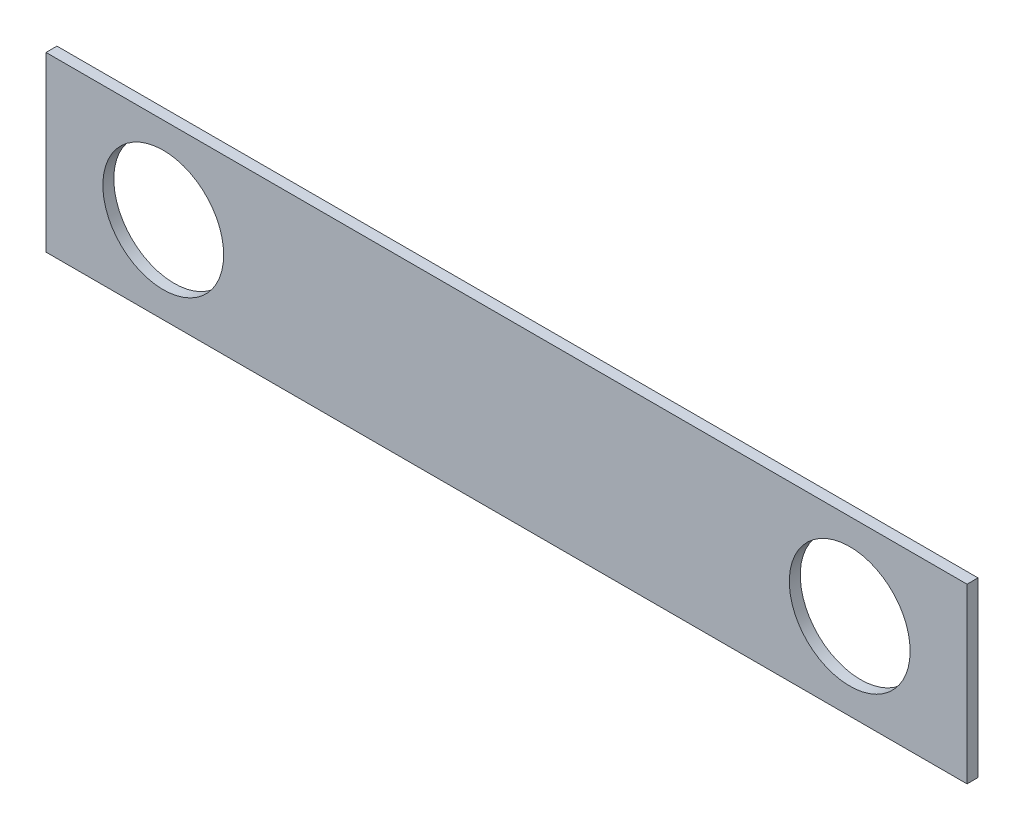
ISO-10303-21;
HEADER;
FILE_DESCRIPTION(('STEP AP214'),'2;1');
FILE_NAME('part.step','',(''),(''),'','','');
FILE_SCHEMA(('AUTOMOTIVE_DESIGN { 1 0 10303 214 1 1 1 1 }'));
ENDSEC;
DATA;
#1=APPLICATION_CONTEXT('core data for automotive mechanical design processes');
#2=APPLICATION_PROTOCOL_DEFINITION('international standard','automotive_design',2000,#1);
#3=PRODUCT_CONTEXT('',#1,'mechanical');
#4=PRODUCT('Part','Part','',(#3));
#5=PRODUCT_RELATED_PRODUCT_CATEGORY('part','',(#4));
#6=PRODUCT_DEFINITION_FORMATION('','',#4);
#7=PRODUCT_DEFINITION_CONTEXT('part definition',#1,'design');
#8=PRODUCT_DEFINITION('design','',#6,#7);
#9=PRODUCT_DEFINITION_SHAPE('','',#8);
#10=(LENGTH_UNIT() NAMED_UNIT(*) SI_UNIT(.MILLI.,.METRE.));
#11=(NAMED_UNIT(*) PLANE_ANGLE_UNIT() SI_UNIT($,.RADIAN.));
#12=(NAMED_UNIT(*) SI_UNIT($,.STERADIAN.) SOLID_ANGLE_UNIT());
#13=UNCERTAINTY_MEASURE_WITH_UNIT(LENGTH_MEASURE(1.E-05),#10,'distance_accuracy_value','');
#14=(GEOMETRIC_REPRESENTATION_CONTEXT(3) GLOBAL_UNCERTAINTY_ASSIGNED_CONTEXT((#13)) GLOBAL_UNIT_ASSIGNED_CONTEXT((#10,
#11,#12)) REPRESENTATION_CONTEXT('',''));
#15=CARTESIAN_POINT('',(0.,0.,0.));
#16=DIRECTION('',(0.,0.,1.));
#17=DIRECTION('',(1.,0.,0.));
#18=AXIS2_PLACEMENT_3D('',#15,#16,#17);
#19=CARTESIAN_POINT('',(0.,0.,0.76));
#20=DIRECTION('',(1.,0.,0.));
#21=DIRECTION('',(0.,0.,-1.));
#22=AXIS2_PLACEMENT_3D('',#19,#20,#21);
#23=PLANE('',#22);
#24=DIRECTION('',(0.,-1.,0.));
#25=VECTOR('',#24,1.);
#26=CARTESIAN_POINT('',(0.,0.,0.));
#27=LINE('',#26,#25);
#28=CARTESIAN_POINT('',(0.,12.,0.));
#29=VERTEX_POINT('',#28);
#30=CARTESIAN_POINT('',(0.,0.,0.));
#31=VERTEX_POINT('',#30);
#32=EDGE_CURVE('E104',#29,#31,#27,.T.);
#33=ORIENTED_EDGE('',*,*,#32,.T.);
#34=DIRECTION('',(0.,0.,-1.));
#35=VECTOR('',#34,1.);
#36=CARTESIAN_POINT('',(0.,0.,0.76));
#37=LINE('',#36,#35);
#38=CARTESIAN_POINT('',(0.,0.,0.76));
#39=VERTEX_POINT('',#38);
#40=EDGE_CURVE('E11',#39,#31,#37,.T.);
#41=ORIENTED_EDGE('',*,*,#40,.F.);
#42=DIRECTION('',(0.,-1.,0.));
#43=VECTOR('',#42,1.);
#44=CARTESIAN_POINT('',(0.,0.,0.76));
#45=LINE('',#44,#43);
#46=CARTESIAN_POINT('',(0.,12.,0.76));
#47=VERTEX_POINT('',#46);
#48=EDGE_CURVE('E92',#47,#39,#45,.T.);
#49=ORIENTED_EDGE('',*,*,#48,.F.);
#50=DIRECTION('',(0.,0.,-1.));
#51=VECTOR('',#50,1.);
#52=CARTESIAN_POINT('',(0.,12.,0.76));
#53=LINE('',#52,#51);
#54=EDGE_CURVE('E100',#47,#29,#53,.T.);
#55=ORIENTED_EDGE('',*,*,#54,.T.);
#56=EDGE_LOOP('',(#33,#41,#49,#55));
#57=FACE_BOUND('',#56,.T.);
#58=ADVANCED_FACE('F41',(#57),#23,.F.);
#59=CARTESIAN_POINT('',(0.,0.,0.76));
#60=DIRECTION('',(0.,1.,0.));
#61=DIRECTION('',(0.,0.,1.));
#62=AXIS2_PLACEMENT_3D('',#59,#60,#61);
#63=PLANE('',#62);
#64=DIRECTION('',(1.,0.,0.));
#65=VECTOR('',#64,1.);
#66=CARTESIAN_POINT('',(0.,0.,0.));
#67=LINE('',#66,#65);
#68=CARTESIAN_POINT('',(63.9,0.,0.));
#69=VERTEX_POINT('',#68);
#70=EDGE_CURVE('E96',#31,#69,#67,.T.);
#71=ORIENTED_EDGE('',*,*,#70,.T.);
#72=DIRECTION('',(0.,0.,-1.));
#73=VECTOR('',#72,1.);
#74=CARTESIAN_POINT('',(63.9,0.,0.76));
#75=LINE('',#74,#73);
#76=CARTESIAN_POINT('',(63.9,0.,0.76));
#77=VERTEX_POINT('',#76);
#78=EDGE_CURVE('E49',#77,#69,#75,.T.);
#79=ORIENTED_EDGE('',*,*,#78,.F.);
#80=DIRECTION('',(1.,0.,0.));
#81=VECTOR('',#80,1.);
#82=CARTESIAN_POINT('',(0.,0.,0.76));
#83=LINE('',#82,#81);
#84=EDGE_CURVE('E87',#39,#77,#83,.T.);
#85=ORIENTED_EDGE('',*,*,#84,.F.);
#86=ORIENTED_EDGE('',*,*,#40,.T.);
#87=EDGE_LOOP('',(#71,#79,#85,#86));
#88=FACE_BOUND('',#87,.T.);
#89=ADVANCED_FACE('F95',(#88),#63,.F.);
#90=CARTESIAN_POINT('',(63.9,0.,0.76));
#91=DIRECTION('',(-1.,0.,0.));
#92=DIRECTION('',(0.,0.,1.));
#93=AXIS2_PLACEMENT_3D('',#90,#91,#92);
#94=PLANE('',#93);
#95=DIRECTION('',(0.,1.,0.));
#96=VECTOR('',#95,1.);
#97=CARTESIAN_POINT('',(63.9,0.,0.));
#98=LINE('',#97,#96);
#99=CARTESIAN_POINT('',(63.9,12.,0.));
#100=VERTEX_POINT('',#99);
#101=EDGE_CURVE('E74',#69,#100,#98,.T.);
#102=ORIENTED_EDGE('',*,*,#101,.T.);
#103=DIRECTION('',(0.,0.,-1.));
#104=VECTOR('',#103,1.);
#105=CARTESIAN_POINT('',(63.9,12.,0.76));
#106=LINE('',#105,#104);
#107=CARTESIAN_POINT('',(63.9,12.,0.76));
#108=VERTEX_POINT('',#107);
#109=EDGE_CURVE('E97',#108,#100,#106,.T.);
#110=ORIENTED_EDGE('',*,*,#109,.F.);
#111=DIRECTION('',(0.,1.,0.));
#112=VECTOR('',#111,1.);
#113=CARTESIAN_POINT('',(63.9,0.,0.76));
#114=LINE('',#113,#112);
#115=EDGE_CURVE('E90',#77,#108,#114,.T.);
#116=ORIENTED_EDGE('',*,*,#115,.F.);
#117=ORIENTED_EDGE('',*,*,#78,.T.);
#118=EDGE_LOOP('',(#102,#110,#116,#117));
#119=FACE_BOUND('',#118,.T.);
#120=ADVANCED_FACE('F98',(#119),#94,.F.);
#121=CARTESIAN_POINT('',(0.,12.,0.76));
#122=DIRECTION('',(0.,-1.,0.));
#123=DIRECTION('',(0.,0.,-1.));
#124=AXIS2_PLACEMENT_3D('',#121,#122,#123);
#125=PLANE('',#124);
#126=DIRECTION('',(-1.,0.,0.));
#127=VECTOR('',#126,1.);
#128=CARTESIAN_POINT('',(0.,12.,0.));
#129=LINE('',#128,#127);
#130=EDGE_CURVE('E80',#100,#29,#129,.T.);
#131=ORIENTED_EDGE('',*,*,#130,.T.);
#132=ORIENTED_EDGE('',*,*,#54,.F.);
#133=DIRECTION('',(-1.,0.,0.));
#134=VECTOR('',#133,1.);
#135=CARTESIAN_POINT('',(0.,12.,0.76));
#136=LINE('',#135,#134);
#137=EDGE_CURVE('E57',#108,#47,#136,.T.);
#138=ORIENTED_EDGE('',*,*,#137,.F.);
#139=ORIENTED_EDGE('',*,*,#109,.T.);
#140=EDGE_LOOP('',(#131,#132,#138,#139));
#141=FACE_BOUND('',#140,.T.);
#142=ADVANCED_FACE('F112',(#141),#125,.F.);
#143=CARTESIAN_POINT('',(0.,0.,0.76));
#144=DIRECTION('',(0.,0.,-1.));
#145=DIRECTION('',(-1.,0.,0.));
#146=AXIS2_PLACEMENT_3D('',#143,#144,#145);
#147=PLANE('',#146);
#148=CARTESIAN_POINT('',(8.135,6.,0.76));
#149=DIRECTION('',(0.,0.,1.));
#150=DIRECTION('',(1.,0.,0.));
#151=AXIS2_PLACEMENT_3D('',#148,#149,#150);
#152=CIRCLE('',#151,4.191);
#153=CARTESIAN_POINT('',(12.326,6.,0.76));
#154=VERTEX_POINT('',#153);
#155=EDGE_CURVE('E124',#154,#154,#152,.T.);
#156=ORIENTED_EDGE('',*,*,#155,.F.);
#157=EDGE_LOOP('',(#156));
#158=FACE_BOUND('',#157,.T.);
#159=CARTESIAN_POINT('',(55.76,6.,0.76));
#160=DIRECTION('',(0.,0.,1.));
#161=DIRECTION('',(1.,0.,0.));
#162=AXIS2_PLACEMENT_3D('',#159,#160,#161);
#163=CIRCLE('',#162,4.191);
#164=CARTESIAN_POINT('',(59.951,6.,0.76));
#165=VERTEX_POINT('',#164);
#166=EDGE_CURVE('E121',#165,#165,#163,.T.);
#167=ORIENTED_EDGE('',*,*,#166,.F.);
#168=EDGE_LOOP('',(#167));
#169=FACE_BOUND('',#168,.T.);
#170=ORIENTED_EDGE('',*,*,#48,.T.);
#171=ORIENTED_EDGE('',*,*,#84,.T.);
#172=ORIENTED_EDGE('',*,*,#115,.T.);
#173=ORIENTED_EDGE('',*,*,#137,.T.);
#174=EDGE_LOOP('',(#170,#171,#172,#173));
#175=FACE_BOUND('',#174,.T.);
#176=ADVANCED_FACE('F88',(#158,#169,#175),#147,.F.);
#177=CARTESIAN_POINT('',(0.,0.,0.));
#178=DIRECTION('',(0.,0.,-1.));
#179=DIRECTION('',(-1.,0.,0.));
#180=AXIS2_PLACEMENT_3D('',#177,#178,#179);
#181=PLANE('',#180);
#182=CARTESIAN_POINT('',(8.135,6.,0.));
#183=DIRECTION('',(0.,0.,1.));
#184=DIRECTION('',(1.,0.,0.));
#185=AXIS2_PLACEMENT_3D('',#182,#183,#184);
#186=CIRCLE('',#185,4.191);
#187=CARTESIAN_POINT('',(12.326,6.,0.));
#188=VERTEX_POINT('',#187);
#189=EDGE_CURVE('E107',#188,#188,#186,.T.);
#190=ORIENTED_EDGE('',*,*,#189,.T.);
#191=EDGE_LOOP('',(#190));
#192=FACE_BOUND('',#191,.T.);
#193=CARTESIAN_POINT('',(55.76,6.,0.));
#194=DIRECTION('',(0.,0.,1.));
#195=DIRECTION('',(1.,0.,0.));
#196=AXIS2_PLACEMENT_3D('',#193,#194,#195);
#197=CIRCLE('',#196,4.191);
#198=CARTESIAN_POINT('',(59.951,6.,0.));
#199=VERTEX_POINT('',#198);
#200=EDGE_CURVE('E118',#199,#199,#197,.T.);
#201=ORIENTED_EDGE('',*,*,#200,.T.);
#202=EDGE_LOOP('',(#201));
#203=FACE_BOUND('',#202,.T.);
#204=ORIENTED_EDGE('',*,*,#32,.F.);
#205=ORIENTED_EDGE('',*,*,#130,.F.);
#206=ORIENTED_EDGE('',*,*,#101,.F.);
#207=ORIENTED_EDGE('',*,*,#70,.F.);
#208=EDGE_LOOP('',(#204,#205,#206,#207));
#209=FACE_BOUND('',#208,.T.);
#210=ADVANCED_FACE('F115',(#192,#203,#209),#181,.T.);
#211=CARTESIAN_POINT('',(55.76,6.,0.));
#212=DIRECTION('',(0.,0.,1.));
#213=DIRECTION('',(1.,0.,0.));
#214=AXIS2_PLACEMENT_3D('',#211,#212,#213);
#215=CYLINDRICAL_SURFACE('',#214,4.191);
#216=ORIENTED_EDGE('',*,*,#200,.F.);
#217=EDGE_LOOP('',(#216));
#218=FACE_BOUND('',#217,.T.);
#219=ORIENTED_EDGE('',*,*,#166,.T.);
#220=EDGE_LOOP('',(#219));
#221=FACE_BOUND('',#220,.T.);
#222=ADVANCED_FACE('F135',(#218,#221),#215,.F.);
#223=CARTESIAN_POINT('',(8.135,6.,0.));
#224=DIRECTION('',(0.,0.,1.));
#225=DIRECTION('',(1.,0.,0.));
#226=AXIS2_PLACEMENT_3D('',#223,#224,#225);
#227=CYLINDRICAL_SURFACE('',#226,4.191);
#228=ORIENTED_EDGE('',*,*,#189,.F.);
#229=EDGE_LOOP('',(#228));
#230=FACE_BOUND('',#229,.T.);
#231=ORIENTED_EDGE('',*,*,#155,.T.);
#232=EDGE_LOOP('',(#231));
#233=FACE_BOUND('',#232,.T.);
#234=ADVANCED_FACE('F132',(#230,#233),#227,.F.);
#235=CLOSED_SHELL('',(#58,#89,#120,#142,#176,#210,#222,#234));
#236=MANIFOLD_SOLID_BREP('B2',#235);
#237=ADVANCED_BREP_SHAPE_REPRESENTATION('',(#18,#236),#14);
#238=SHAPE_DEFINITION_REPRESENTATION(#9,#237);
ENDSEC;
END-ISO-10303-21;
